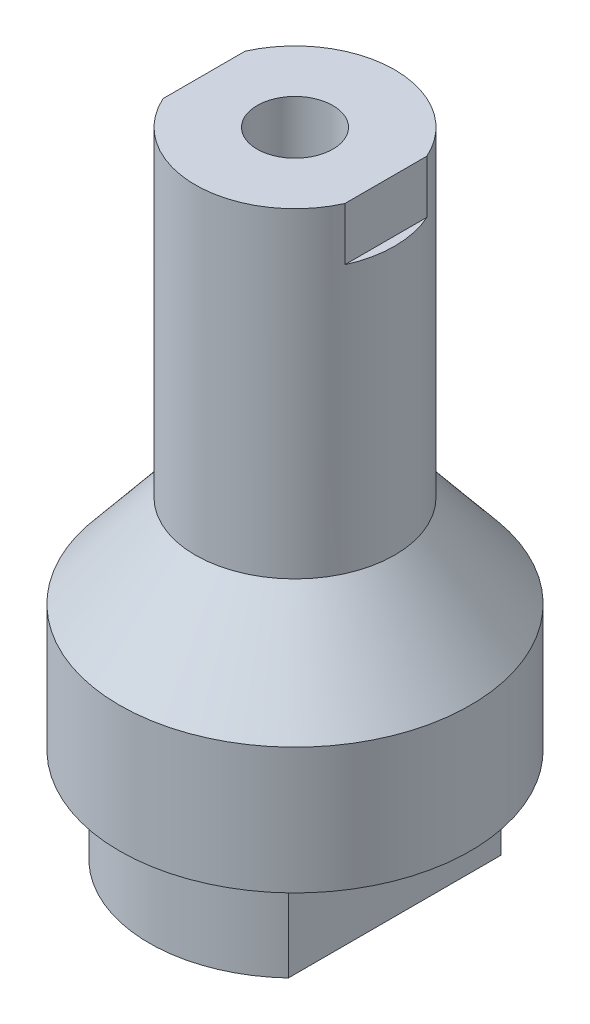
ISO-10303-21;
HEADER;
FILE_DESCRIPTION(('STEP AP214'),'2;1');
FILE_NAME('part.step','',(''),(''),'','','');
FILE_SCHEMA(('AUTOMOTIVE_DESIGN { 1 0 10303 214 1 1 1 1 }'));
ENDSEC;
DATA;
#1=APPLICATION_CONTEXT('core data for automotive mechanical design processes');
#2=APPLICATION_PROTOCOL_DEFINITION('international standard','automotive_design',2000,#1);
#3=PRODUCT_CONTEXT('',#1,'mechanical');
#4=PRODUCT('Part','Part','',(#3));
#5=PRODUCT_RELATED_PRODUCT_CATEGORY('part','',(#4));
#6=PRODUCT_DEFINITION_FORMATION('','',#4);
#7=PRODUCT_DEFINITION_CONTEXT('part definition',#1,'design');
#8=PRODUCT_DEFINITION('design','',#6,#7);
#9=PRODUCT_DEFINITION_SHAPE('','',#8);
#10=(LENGTH_UNIT() NAMED_UNIT(*) SI_UNIT(.MILLI.,.METRE.));
#11=(NAMED_UNIT(*) PLANE_ANGLE_UNIT() SI_UNIT($,.RADIAN.));
#12=(NAMED_UNIT(*) SI_UNIT($,.STERADIAN.) SOLID_ANGLE_UNIT());
#13=UNCERTAINTY_MEASURE_WITH_UNIT(LENGTH_MEASURE(1.E-05),#10,'distance_accuracy_value','');
#14=(GEOMETRIC_REPRESENTATION_CONTEXT(3) GLOBAL_UNCERTAINTY_ASSIGNED_CONTEXT((#13)) GLOBAL_UNIT_ASSIGNED_CONTEXT((#10,
#11,#12)) REPRESENTATION_CONTEXT('',''));
#15=CARTESIAN_POINT('',(0.,0.,0.));
#16=DIRECTION('',(0.,0.,1.));
#17=DIRECTION('',(1.,0.,0.));
#18=AXIS2_PLACEMENT_3D('',#15,#16,#17);
#19=CARTESIAN_POINT('',(-3.95,25.1,0.));
#20=DIRECTION('',(0.,-1.,0.));
#21=DIRECTION('',(0.,0.,-1.));
#22=AXIS2_PLACEMENT_3D('',#19,#20,#21);
#23=PLANE('',#22);
#24=CARTESIAN_POINT('',(0.,25.1,0.));
#25=DIRECTION('',(0.,1.,0.));
#26=DIRECTION('',(0.,0.,1.));
#27=AXIS2_PLACEMENT_3D('',#24,#25,#26);
#28=CIRCLE('',#27,1.5);
#29=CARTESIAN_POINT('',(0.,25.1,1.5));
#30=VERTEX_POINT('',#29);
#31=EDGE_CURVE('E195',#30,#30,#28,.T.);
#32=ORIENTED_EDGE('',*,*,#31,.F.);
#33=EDGE_LOOP('',(#32));
#34=FACE_BOUND('',#33,.T.);
#35=DIRECTION('',(0.,0.,1.));
#36=VECTOR('',#35,1.);
#37=CARTESIAN_POINT('',(3.6,25.1,-6.95));
#38=LINE('',#37,#36);
#39=CARTESIAN_POINT('',(3.6,25.1,-1.6255768207009));
#40=VERTEX_POINT('',#39);
#41=CARTESIAN_POINT('',(3.59999999999999,25.1,1.6255768207009));
#42=VERTEX_POINT('',#41);
#43=EDGE_CURVE('E72',#40,#42,#38,.T.);
#44=ORIENTED_EDGE('',*,*,#43,.F.);
#45=CARTESIAN_POINT('',(0.,25.1,0.));
#46=DIRECTION('',(0.,-1.,0.));
#47=DIRECTION('',(0.,0.,-1.));
#48=AXIS2_PLACEMENT_3D('',#45,#46,#47);
#49=CIRCLE('',#48,3.95);
#50=CARTESIAN_POINT('',(-3.6,25.1,-1.6255768207009));
#51=VERTEX_POINT('',#50);
#52=EDGE_CURVE('E161',#51,#40,#49,.T.);
#53=ORIENTED_EDGE('',*,*,#52,.F.);
#54=DIRECTION('',(0.,0.,1.));
#55=VECTOR('',#54,1.);
#56=CARTESIAN_POINT('',(-3.6,25.1,-6.95));
#57=LINE('',#56,#55);
#58=CARTESIAN_POINT('',(-3.6,25.1,1.6255768207009));
#59=VERTEX_POINT('',#58);
#60=EDGE_CURVE('E269',#51,#59,#57,.T.);
#61=ORIENTED_EDGE('',*,*,#60,.T.);
#62=EDGE_CURVE('E164',#42,#59,#49,.T.);
#63=ORIENTED_EDGE('',*,*,#62,.F.);
#64=EDGE_LOOP('',(#44,#53,#61,#63));
#65=FACE_BOUND('',#64,.T.);
#66=ADVANCED_FACE('F44',(#34,#65),#23,.F.);
#67=CARTESIAN_POINT('',(0.,0.,0.));
#68=DIRECTION('',(0.,-1.,0.));
#69=DIRECTION('',(0.,0.,-1.));
#70=AXIS2_PLACEMENT_3D('',#67,#68,#69);
#71=CYLINDRICAL_SURFACE('',#70,5.775);
#72=CARTESIAN_POINT('',(0.,0.,0.));
#73=DIRECTION('',(0.,-1.,0.));
#74=DIRECTION('',(0.,0.,-1.));
#75=AXIS2_PLACEMENT_3D('',#72,#73,#74);
#76=CIRCLE('',#75,5.775);
#77=CARTESIAN_POINT('',(3.95,0.,4.21285235915051));
#78=VERTEX_POINT('',#77);
#79=CARTESIAN_POINT('',(-3.95,0.,4.21285235915051));
#80=VERTEX_POINT('',#79);
#81=EDGE_CURVE('E149',#78,#80,#76,.T.);
#82=ORIENTED_EDGE('',*,*,#81,.F.);
#83=DIRECTION('',(0.,-1.,0.));
#84=VECTOR('',#83,1.);
#85=CARTESIAN_POINT('',(3.95,0.,4.21285235915051));
#86=LINE('',#85,#84);
#87=CARTESIAN_POINT('',(3.95,3.75,4.21285235915051));
#88=VERTEX_POINT('',#87);
#89=EDGE_CURVE('E122',#78,#88,#86,.F.);
#90=ORIENTED_EDGE('',*,*,#89,.T.);
#91=CARTESIAN_POINT('',(0.,3.75,0.));
#92=DIRECTION('',(0.,-1.,0.));
#93=DIRECTION('',(0.,0.,-1.));
#94=AXIS2_PLACEMENT_3D('',#91,#92,#93);
#95=CIRCLE('',#94,5.775);
#96=CARTESIAN_POINT('',(-3.95,3.75,4.21285235915051));
#97=VERTEX_POINT('',#96);
#98=EDGE_CURVE('E131',#88,#97,#95,.T.);
#99=ORIENTED_EDGE('',*,*,#98,.T.);
#100=DIRECTION('',(0.,-1.,0.));
#101=VECTOR('',#100,1.);
#102=CARTESIAN_POINT('',(-3.95,0.,4.21285235915051));
#103=LINE('',#102,#101);
#104=EDGE_CURVE('E114',#97,#80,#103,.T.);
#105=ORIENTED_EDGE('',*,*,#104,.T.);
#106=EDGE_LOOP('',(#82,#90,#99,#105));
#107=FACE_BOUND('',#106,.T.);
#108=ADVANCED_FACE('F137',(#107),#71,.T.);
#109=CARTESIAN_POINT('',(-5.775,0.,0.));
#110=DIRECTION('',(0.,1.,0.));
#111=DIRECTION('',(0.,0.,1.));
#112=AXIS2_PLACEMENT_3D('',#109,#110,#111);
#113=PLANE('',#112);
#114=CARTESIAN_POINT('',(0.,0.,1.5));
#115=CARTESIAN_POINT('',(0.0247347685201529,0.,1.50000191731977));
#116=CARTESIAN_POINT('',(0.0494707785274616,0.,1.49941047911439));
#117=CARTESIAN_POINT('',(0.0987112851079547,0.,1.49702973717077));
#118=CARTESIAN_POINT('',(0.123216190082783,0.,1.49524884881535));
#119=CARTESIAN_POINT('',(0.171994793238904,0.,1.49048966041373));
#120=CARTESIAN_POINT('',(0.196269036682613,0.,1.48751696987769));
#121=CARTESIAN_POINT('',(0.244586042998842,0.,1.4803776814201));
#122=CARTESIAN_POINT('',(0.268629201508652,0.,1.47621376215505));
#123=CARTESIAN_POINT('',(0.316484279184045,0.,1.46669479873131));
#124=CARTESIAN_POINT('',(0.340296144201122,0.,1.46133948234814));
#125=CARTESIAN_POINT('',(0.387689162550824,0.,1.44944085464064));
#126=CARTESIAN_POINT('',(0.411269522479252,0.,1.44289438479575));
#127=CARTESIAN_POINT('',(0.45820019306478,0.,1.4286158629683));
#128=CARTESIAN_POINT('',(0.481548707481012,0.,1.4208779118391));
#129=CARTESIAN_POINT('',(0.528017236187306,0.,1.4042208104248));
#130=CARTESIAN_POINT('',(0.551134233991374,0.,1.3952932559666));
#131=CARTESIAN_POINT('',(0.596863360533481,0.,1.3763671537974));
#132=CARTESIAN_POINT('',(0.619476529112188,0.,1.36637111919515));
#133=CARTESIAN_POINT('',(0.664034064580823,0.,1.34535395524988));
#134=CARTESIAN_POINT('',(0.685981934198691,0.,1.33434026040495));
#135=CARTESIAN_POINT('',(0.729210117766951,0.,1.31129212983656));
#136=CARTESIAN_POINT('',(0.750492963164667,0.,1.29926244372847));
#137=CARTESIAN_POINT('',(0.792392002461754,0.,1.27418461850148));
#138=CARTESIAN_POINT('',(0.813009449986805,0.,1.26113857441519));
#139=CARTESIAN_POINT('',(0.853579049090866,0.,1.23403079687982));
#140=CARTESIAN_POINT('',(0.873530892242338,0.,1.21996860186597));
#141=CARTESIAN_POINT('',(0.912770987715195,0.,1.19083115451219));
#142=CARTESIAN_POINT('',(0.932057129930069,0.,1.17575306119576));
#143=CARTESIAN_POINT('',(0.969967308363591,0.,1.14458573744704));
#144=CARTESIAN_POINT('',(0.988587248641874,0.,1.12849152738394));
#145=CARTESIAN_POINT('',(1.0251683934935,0.,1.0952956693226));
#146=CARTESIAN_POINT('',(1.04312341285187,0.,1.07818721107137));
#147=CARTESIAN_POINT('',(1.07814252919734,0.,1.04318750384702));
#148=CARTESIAN_POINT('',(1.09520921716562,0.,1.02529884784115));
#149=CARTESIAN_POINT('',(1.12833220882844,0.,0.988830206366507));
#150=CARTESIAN_POINT('',(1.14439459506981,0.,0.970255750427472));
#151=CARTESIAN_POINT('',(1.17551206025706,0.,0.932419313632601));
#152=CARTESIAN_POINT('',(1.19057129531396,0.,0.913160751866436));
#153=CARTESIAN_POINT('',(1.21968410022337,0.,0.873957802530341));
#154=CARTESIAN_POINT('',(1.23373963003822,0.,0.854014870805264));
#155=CARTESIAN_POINT('',(1.2608473527173,0.,0.81344523431549));
#156=CARTESIAN_POINT('',(1.27389908400022,0.,0.792818221152427));
#157=CARTESIAN_POINT('',(1.29900178729561,0.,0.750882196087031));
#158=CARTESIAN_POINT('',(1.31104972262622,0.,0.729571366964465));
#159=CARTESIAN_POINT('',(1.33414694196369,0.,0.68626891710449));
#160=CARTESIAN_POINT('',(1.34519053619435,0.,0.664274263238092));
#161=CARTESIAN_POINT('',(1.36628360233903,0.,0.61960629138295));
#162=CARTESIAN_POINT('',(1.37632475368796,0.,0.596929048519568));
#163=CARTESIAN_POINT('',(1.39528439042207,0.,0.551192299717979));
#164=CARTESIAN_POINT('',(1.40420626184726,0.,0.528134197843505));
#165=CARTESIAN_POINT('',(1.42085197100997,0.,0.481765946269994));
#166=CARTESIAN_POINT('',(1.42858354434745,0.,0.458458577500448));
#167=CARTESIAN_POINT('',(1.44285295603563,0.,0.411594129577346));
#168=CARTESIAN_POINT('',(1.44939594256118,0.,0.388038618775925));
#169=CARTESIAN_POINT('',(1.46129034794042,0.,0.340678828161953));
#170=CARTESIAN_POINT('',(1.4666441346909,0.,0.31687514332955));
#171=CARTESIAN_POINT('',(1.47616307710533,0.,0.269020010176734));
#172=CARTESIAN_POINT('',(1.4803276883048,0.,0.244968453572904));
#173=CARTESIAN_POINT('',(1.48747134007836,0.,0.196618229681386));
#174=CARTESIAN_POINT('',(1.49044687970416,0.,0.172319045588958));
#175=CARTESIAN_POINT('',(1.49521479776574,0.,0.123473875281554));
#176=CARTESIAN_POINT('',(1.49700075880554,0.,0.0989272642038695));
#177=CARTESIAN_POINT('',(1.49939451810823,0.,0.0495874722967311));
#178=CARTESIAN_POINT('',(1.49999312718683,0.,0.0247938494983392));
#179=CARTESIAN_POINT('',(1.50000685149273,0.,-0.0247169354649001));
#180=CARTESIAN_POINT('',(1.49942563232503,0.,-0.0494340962254184));
#181=CARTESIAN_POINT('',(1.49705990065969,0.,-0.0986428119290848));
#182=CARTESIAN_POINT('',(1.49528359914018,0.,-0.123134757914345));
#183=CARTESIAN_POINT('',(1.49053256875276,0.,-0.171892529595621));
#184=CARTESIAN_POINT('',(1.48756319636062,0.,-0.196158876444427));
#185=CARTESIAN_POINT('',(1.48042838681365,0.,-0.244465409533176));
#186=CARTESIAN_POINT('',(1.47626536499926,0.,-0.26850595223801));
#187=CARTESIAN_POINT('',(1.46674635445589,0.,-0.316361071839137));
#188=CARTESIAN_POINT('',(1.46138982126907,0.,-0.340175540418728));
#189=CARTESIAN_POINT('',(1.44948686529562,0.,-0.387579079844759));
#190=CARTESIAN_POINT('',(1.4429370102819,0.,-0.411167288401608));
#191=CARTESIAN_POINT('',(1.42864975476398,0.,-0.458118944759668));
#192=CARTESIAN_POINT('',(1.42090618623437,0.,-0.481480514027625));
#193=CARTESIAN_POINT('',(1.40423621054066,0.,-0.527980589935173));
#194=CARTESIAN_POINT('',(1.39530114454309,0.,-0.551115988352237));
#195=CARTESIAN_POINT('',(1.37636686701955,0.,-0.596863241282831));
#196=CARTESIAN_POINT('',(1.36637104260843,0.,-0.61947649726523));
#197=CARTESIAN_POINT('',(1.3453540313156,0.,-0.664034096211297));
#198=CARTESIAN_POINT('',(1.3343402807432,0.,-0.685981942656063));
#199=CARTESIAN_POINT('',(1.31129210958844,0.,-0.729210109347346));
#200=CARTESIAN_POINT('',(1.29926243830786,0.,-0.750492960910791));
#201=CARTESIAN_POINT('',(1.27418462391098,0.,-0.79239200471137));
#202=CARTESIAN_POINT('',(1.26113857586505,0.,-0.813009450589888));
#203=CARTESIAN_POINT('',(1.23403079542907,0.,-0.853579048487794));
#204=CARTESIAN_POINT('',(1.21996860147656,0.,-0.873530892080598));
#205=CARTESIAN_POINT('',(1.19083115490252,0.,-0.91277098787768));
#206=CARTESIAN_POINT('',(1.17575306130056,0.,-0.932057129973811));
#207=CARTESIAN_POINT('',(1.1445857373415,0.,-0.969967308319832));
#208=CARTESIAN_POINT('',(1.12849152735552,0.,-0.988587248630164));
#209=CARTESIAN_POINT('',(1.09529566935114,0.,-1.02516839350542));
#210=CARTESIAN_POINT('',(1.07818721107899,0.,-1.04312341285507));
#211=CARTESIAN_POINT('',(1.0431875038394,0.,-1.07814252919417));
#212=CARTESIAN_POINT('',(1.02529884783911,0.,-1.09520921716477));
#213=CARTESIAN_POINT('',(0.988830206368514,0.,-1.12833220882927));
#214=CARTESIAN_POINT('',(0.970255750427997,0.,-1.14439459507003));
#215=CARTESIAN_POINT('',(0.932419313632045,0.,-1.17551206025683));
#216=CARTESIAN_POINT('',(0.913160751866272,0.,-1.19057129531389));
#217=CARTESIAN_POINT('',(0.873957802530463,0.,-1.21968410022342));
#218=CARTESIAN_POINT('',(0.85401487080528,0.,-1.23373963003823));
#219=CARTESIAN_POINT('',(0.813445234315428,0.,-1.26084735271728));
#220=CARTESIAN_POINT('',(0.792818221152394,0.,-1.27389908400021));
#221=CARTESIAN_POINT('',(0.750882196087021,0.,-1.29900178729561));
#222=CARTESIAN_POINT('',(0.729571366964449,0.,-1.31104972262622));
#223=CARTESIAN_POINT('',(0.686268917104472,0.,-1.33414694196368));
#224=CARTESIAN_POINT('',(0.664274263238079,0.,-1.34519053619434));
#225=CARTESIAN_POINT('',(0.619606291382943,0.,-1.36628360233903));
#226=CARTESIAN_POINT('',(0.596929048519564,0.,-1.37632475368796));
#227=CARTESIAN_POINT('',(0.551192299717963,0.,-1.39528439042208));
#228=CARTESIAN_POINT('',(0.528134197843473,0.,-1.40420626184728));
#229=CARTESIAN_POINT('',(0.481765946269936,0.,-1.42085197101));
#230=CARTESIAN_POINT('',(0.45845857750038,0.,-1.4285835443475));
#231=CARTESIAN_POINT('',(0.411594129577261,0.,-1.44285295603568));
#232=CARTESIAN_POINT('',(0.388038618775832,0.,-1.44939594256124));
#233=CARTESIAN_POINT('',(0.340678828161852,0.,-1.46129034794048));
#234=CARTESIAN_POINT('',(0.316875143329447,0.,-1.46664413469097));
#235=CARTESIAN_POINT('',(0.269020010176631,0.,-1.47616307710539));
#236=CARTESIAN_POINT('',(0.244968453572804,0.,-1.48032768830486));
#237=CARTESIAN_POINT('',(0.196618229681294,0.,-1.48747134007842));
#238=CARTESIAN_POINT('',(0.172319045588873,0.,-1.49044687970421));
#239=CARTESIAN_POINT('',(0.123473875281486,0.,-1.49521479776578));
#240=CARTESIAN_POINT('',(0.0989272642038126,0.,-1.49700075880558));
#241=CARTESIAN_POINT('',(0.0495874722967004,0.,-1.49939451810825));
#242=CARTESIAN_POINT('',(0.024793849498324,0.,-1.49999312718684));
#243=CARTESIAN_POINT('',(-0.0247169354649021,0.,-1.50000685149272));
#244=CARTESIAN_POINT('',(-0.0494340962254227,0.,-1.49942563232501));
#245=CARTESIAN_POINT('',(-0.0986428119290929,0.,-1.49705990065965));
#246=CARTESIAN_POINT('',(-0.123134757914355,0.,-1.49528359914014));
#247=CARTESIAN_POINT('',(-0.171892529595633,0.,-1.49053256875271));
#248=CARTESIAN_POINT('',(-0.19615887644444,0.,-1.48756319636057));
#249=CARTESIAN_POINT('',(-0.244465409533189,0.,-1.48042838681359));
#250=CARTESIAN_POINT('',(-0.268505952238023,0.,-1.47626536499919));
#251=CARTESIAN_POINT('',(-0.316361071839151,0.,-1.46674635445583));
#252=CARTESIAN_POINT('',(-0.340175540418741,0.,-1.46138982126901));
#253=CARTESIAN_POINT('',(-0.387579079844771,0.,-1.44948686529556));
#254=CARTESIAN_POINT('',(-0.411167288401619,0.,-1.44293701028185));
#255=CARTESIAN_POINT('',(-0.458118944759677,0.,-1.42864975476394));
#256=CARTESIAN_POINT('',(-0.481480514027632,0.,-1.42090618623434));
#257=CARTESIAN_POINT('',(-0.527980589935176,0.,-1.40423621054064));
#258=CARTESIAN_POINT('',(-0.551115988352239,0.,-1.39530114454308));
#259=CARTESIAN_POINT('',(-0.596863241282786,0.,-1.37636686701958));
#260=CARTESIAN_POINT('',(-0.61947649726514,0.,-1.36637104260848));
#261=CARTESIAN_POINT('',(-0.664034096211131,0.,-1.3453540313157));
#262=CARTESIAN_POINT('',(-0.685981942655866,0.,-1.33434028074332));
#263=CARTESIAN_POINT('',(-0.729210109347099,0.,-1.31129210958859));
#264=CARTESIAN_POINT('',(-0.750492960910523,0.,-1.29926243830802));
#265=CARTESIAN_POINT('',(-0.792392004711078,0.,-1.27418462391115));
#266=CARTESIAN_POINT('',(-0.813009450589589,0.,-1.26113857586523));
#267=CARTESIAN_POINT('',(-0.853579048487496,0.,-1.23403079542925));
#268=CARTESIAN_POINT('',(-0.873530892080306,0.,-1.21996860147674));
#269=CARTESIAN_POINT('',(-0.912770987877413,0.,-1.19083115490268));
#270=CARTESIAN_POINT('',(-0.932057129973562,0.,-1.17575306130071));
#271=CARTESIAN_POINT('',(-0.969967308319634,0.,-1.14458573734162));
#272=CARTESIAN_POINT('',(-0.988587248629997,0.,-1.12849152735561));
#273=CARTESIAN_POINT('',(-1.02516839350534,0.,-1.09529566935119));
#274=CARTESIAN_POINT('',(-1.04312341285502,0.,-1.07818721107902));
#275=CARTESIAN_POINT('',(-1.07814252919418,0.,-1.04318750383941));
#276=CARTESIAN_POINT('',(-1.09520921716479,0.,-1.02529884783912));
#277=CARTESIAN_POINT('',(-1.12833220882931,0.,-0.988830206368542));
#278=CARTESIAN_POINT('',(-1.14439459507007,0.,-0.97025575042803));
#279=CARTESIAN_POINT('',(-1.17551206025689,0.,-0.932419313632085));
#280=CARTESIAN_POINT('',(-1.19057129531396,0.,-0.913160751866316));
#281=CARTESIAN_POINT('',(-1.2196841002235,0.,-0.873957802530511));
#282=CARTESIAN_POINT('',(-1.2337396300383,0.,-0.854014870805329));
#283=CARTESIAN_POINT('',(-1.26084735271735,0.,-0.813445234315477));
#284=CARTESIAN_POINT('',(-1.27389908400028,0.,-0.792818221152442));
#285=CARTESIAN_POINT('',(-1.29900178729568,0.,-0.750882196087065));
#286=CARTESIAN_POINT('',(-1.31104972262628,0.,-0.72957136696449));
#287=CARTESIAN_POINT('',(-1.33414694196373,0.,-0.686268917104504));
#288=CARTESIAN_POINT('',(-1.34519053619439,0.,-0.664274263238106));
#289=CARTESIAN_POINT('',(-1.36628360233905,0.,-0.619606291382958));
#290=CARTESIAN_POINT('',(-1.37632475368797,0.,-0.596929048519571));
#291=CARTESIAN_POINT('',(-1.39528439042207,0.,-0.55119229971795));
#292=CARTESIAN_POINT('',(-1.40420626184726,0.,-0.528134197843449));
#293=CARTESIAN_POINT('',(-1.42085197100997,0.,-0.481765946269892));
#294=CARTESIAN_POINT('',(-1.42858354434745,0.,-0.458458577500327));
#295=CARTESIAN_POINT('',(-1.44285295603563,0.,-0.411594129577195));
#296=CARTESIAN_POINT('',(-1.44939594256118,0.,-0.388038618775762));
#297=CARTESIAN_POINT('',(-1.46129034794042,0.,-0.340678828161775));
#298=CARTESIAN_POINT('',(-1.4666441346909,0.,-0.316875143329369));
#299=CARTESIAN_POINT('',(-1.47616307710533,0.,-0.269020010176552));
#300=CARTESIAN_POINT('',(-1.4803276883048,0.,-0.244968453572727));
#301=CARTESIAN_POINT('',(-1.48747134007836,0.,-0.196618229681224));
#302=CARTESIAN_POINT('',(-1.49044687970416,0.,-0.172319045588808));
#303=CARTESIAN_POINT('',(-1.49521479776574,0.,-0.123473875281435));
#304=CARTESIAN_POINT('',(-1.49700075880555,0.,-0.0989272642037694));
#305=CARTESIAN_POINT('',(-1.49939451810823,0.,-0.0495874722966772));
#306=CARTESIAN_POINT('',(-1.49999312718683,0.,-0.0247938494983124));
#307=CARTESIAN_POINT('',(-1.50000685149273,0.,0.0247169354648811));
#308=CARTESIAN_POINT('',(-1.49942563232503,0.,0.0494340962253807));
#309=CARTESIAN_POINT('',(-1.49705990065969,0.,0.098642811929015));
#310=CARTESIAN_POINT('',(-1.49528359914018,0.,0.123134757914262));
#311=CARTESIAN_POINT('',(-1.49053256875276,0.,0.171892529595516));
#312=CARTESIAN_POINT('',(-1.48756319636062,0.,0.196158876444314));
#313=CARTESIAN_POINT('',(-1.48042838681365,0.,0.244465409533052));
#314=CARTESIAN_POINT('',(-1.47626536499926,0.,0.268505952237883));
#315=CARTESIAN_POINT('',(-1.46674635445589,0.,0.316361071839011));
#316=CARTESIAN_POINT('',(-1.46138982126907,0.,0.340175540418604));
#317=CARTESIAN_POINT('',(-1.44948686529562,0.,0.387579079844646));
#318=CARTESIAN_POINT('',(-1.4429370102819,0.,0.411167288401503));
#319=CARTESIAN_POINT('',(-1.42864975476398,0.,0.458118944759585));
#320=CARTESIAN_POINT('',(-1.42090618623437,0.,0.481480514027555));
#321=CARTESIAN_POINT('',(-1.40423621054066,0.,0.527980589935135));
#322=CARTESIAN_POINT('',(-1.39530114454309,0.,0.551115988352218));
#323=CARTESIAN_POINT('',(-1.37636686701958,0.,0.596863241282787));
#324=CARTESIAN_POINT('',(-1.36637104260848,0.,0.619476497265143));
#325=CARTESIAN_POINT('',(-1.3453540313157,0.,0.664034096211133));
#326=CARTESIAN_POINT('',(-1.33434028074332,0.,0.685981942655866));
#327=CARTESIAN_POINT('',(-1.31129210958859,0.,0.729210109347105));
#328=CARTESIAN_POINT('',(-1.29926243830802,0.,0.750492960910538));
#329=CARTESIAN_POINT('',(-1.27418462391114,0.,0.792392004711071));
#330=CARTESIAN_POINT('',(-1.26113857586521,0.,0.813009450589554));
#331=CARTESIAN_POINT('',(-1.23403079542926,0.,0.853579048487538));
#332=CARTESIAN_POINT('',(-1.21996860147679,0.,0.873530892080454));
#333=CARTESIAN_POINT('',(-1.19083115490261,0.,0.912770987877271));
#334=CARTESIAN_POINT('',(-1.17575306130048,0.,0.932057129973023));
#335=CARTESIAN_POINT('',(-1.14458573734184,0.,0.969967308320182));
#336=CARTESIAN_POINT('',(-1.12849152735646,0.,0.98858724863204));
#337=CARTESIAN_POINT('',(-1.09529566935033,0.,1.02516839350328));
#338=CARTESIAN_POINT('',(-1.07818721107581,0.,1.04312341284731));
#339=CARTESIAN_POINT('',(-1.04318750384264,0.,1.07814252920183));
#340=CARTESIAN_POINT('',(-1.02529884785113,0.,1.09520921719338));
#341=CARTESIAN_POINT('',(-0.988830206356794,0.,1.12833220880074));
#342=CARTESIAN_POINT('',(-0.970255750384033,0.,1.14439459496408));
#343=CARTESIAN_POINT('',(-0.932419313676199,0.,1.1755120603621));
#344=CARTESIAN_POINT('',(-0.913160752030113,0.,1.19057129570617));
#345=CARTESIAN_POINT('',(-0.873957802367435,0.,1.21968409983168));
#346=CARTESIAN_POINT('',(-0.854014870196835,0.,1.23373962857818));
#347=CARTESIAN_POINT('',(-0.813445234924669,0.,1.26084735417772));
#348=CARTESIAN_POINT('',(-0.792818223425702,0.,1.27389908945174));
#349=CARTESIAN_POINT('',(-0.750882193807554,0.,1.29900178182788));
#350=CARTESIAN_POINT('',(-0.729571358445092,0.,1.31104970219284));
#351=CARTESIAN_POINT('',(-0.686268925669809,0.,1.3341469625062));
#352=CARTESIAN_POINT('',(-0.664274295286405,0.,1.34519061305832));
#353=CARTESIAN_POINT('',(-0.619606259087762,0.,1.36628352488235));
#354=CARTESIAN_POINT('',(-0.59692892753835,0.,1.37632446352768));
#355=CARTESIAN_POINT('',(-0.551174025918391,0.,1.39529230514219));
#356=CARTESIAN_POINT('',(-0.528097495867629,0.,1.40422171623575));
#357=CARTESIAN_POINT('',(-0.481697648144714,0.,1.42088034614802));
#358=CARTESIAN_POINT('',(-0.458377204301374,0.,1.42861755810062));
#359=CARTESIAN_POINT('',(-0.411491739369876,0.,1.4428957315904));
#360=CARTESIAN_POINT('',(-0.387928369299311,0.,1.44944211148131));
#361=CARTESIAN_POINT('',(-0.340558037167883,0.,1.46134087072968));
#362=CARTESIAN_POINT('',(-0.316751739183612,0.,1.4666958924649));
#363=CARTESIAN_POINT('',(-0.2688965788893,0.,1.47621484357386));
#364=CARTESIAN_POINT('',(-0.244847662433325,0.,1.48037850069419));
#365=CARTESIAN_POINT('',(-0.196507871831742,0.,1.48751780205908));
#366=CARTESIAN_POINT('',(-0.172216519719741,0.,1.49049020834572));
#367=CARTESIAN_POINT('',(-0.123392423045591,0.,1.49524939885631));
#368=CARTESIAN_POINT('',(-0.098859079476897,0.,1.49703001297542));
#369=CARTESIAN_POINT('',(-0.0495503373854434,0.,1.49941074318796));
#370=CARTESIAN_POINT('',(-0.0247745043790516,0.,1.50000189650473));
#371=CARTESIAN_POINT('',(0.,0.,1.5));
#372=B_SPLINE_CURVE_WITH_KNOTS('',3,(#114,#115,#116,#117,#118,#119,#120,#121,#122,#123,#124,
#125,#126,#127,#128,#129,#130,#131,#132,#133,#134,#135,#136,#137,#138,#139,#140,#141,#142,#143,
#144,#145,#146,#147,#148,#149,#150,#151,#152,#153,#154,#155,#156,#157,#158,#159,#160,#161,#162,
#163,#164,#165,#166,#167,#168,#169,#170,#171,#172,#173,#174,#175,#176,#177,#178,#179,#180,#181,
#182,#183,#184,#185,#186,#187,#188,#189,#190,#191,#192,#193,#194,#195,#196,#197,#198,#199,#200,
#201,#202,#203,#204,#205,#206,#207,#208,#209,#210,#211,#212,#213,#214,#215,#216,#217,#218,#219,
#220,#221,#222,#223,#224,#225,#226,#227,#228,#229,#230,#231,#232,#233,#234,#235,#236,#237,#238,
#239,#240,#241,#242,#243,#244,#245,#246,#247,#248,#249,#250,#251,#252,#253,#254,#255,#256,#257,
#258,#259,#260,#261,#262,#263,#264,#265,#266,#267,#268,#269,#270,#271,#272,#273,#274,#275,#276,
#277,#278,#279,#280,#281,#282,#283,#284,#285,#286,#287,#288,#289,#290,#291,#292,#293,#294,#295,
#296,#297,#298,#299,#300,#301,#302,#303,#304,#305,#306,#307,#308,#309,#310,#311,#312,#313,#314,
#315,#316,#317,#318,#319,#320,#321,#322,#323,#324,#325,#326,#327,#328,#329,#330,#331,#332,#333,
#334,#335,#336,#337,#338,#339,#340,#341,#342,#343,#344,#345,#346,#347,#348,#349,#350,#351,#352,
#353,#354,#355,#356,#357,#358,#359,#360,#361,#362,#363,#364,#365,#366,#367,#368,#369,#370,#371),
.UNSPECIFIED.,.F.,.F.,(4,2,2,2,2,2,2,2,2,2,2,2,2,2,2,2,2,2,2,2,2,2,2,2,2,2,2,2,2,2,2,2,2,2,2,2,
2,2,2,2,2,2,2,2,2,2,2,2,2,2,2,2,2,2,2,2,2,2,2,2,2,2,2,2,2,2,2,2,2,2,2,2,2,2,2,2,2,2,2,2,2,2,2,2,
2,2,2,2,2,2,2,2,2,2,2,2,2,2,2,2,2,2,2,2,2,2,2,2,2,2,2,2,2,2,2,2,2,2,2,2,2,2,2,2,2,2,2,2,4),(0.,
0.0741989708048877,0.147878466158508,0.221215167441706,0.294388239176562,0.367578047562738,
0.440964835396602,0.514727401499044,0.589041832398692,0.663185166529015,0.736824221437623,
0.810136292194274,0.883301050981176,0.956499254763681,1.02991141346064,1.10371646715639,
1.17809052013483,1.25223385426517,1.32587290917379,1.39918497993044,1.47234973871734,
1.54554794249985,1.61896010119681,1.69276515489255,1.76713920787098,1.84128254200125,
1.91492159690982,1.98823366766645,2.06139842645334,2.13459663023586,2.20800878893284,
2.28181384262863,2.35618789560711,2.43033122973744,2.50397028464604,2.57728235540269,
2.65044711418959,2.7236453179721,2.79705747666907,2.87086253036482,2.94523658334327,
3.01937991747367,3.09301897238234,3.16633104313903,3.23949580192594,3.31269400570844,
3.38610616440536,3.45991121810105,3.53428527107941,3.60842860520975,3.68206766011837,
3.75537973087503,3.82854448966193,3.90174269344444,3.97515485214139,4.04895990583713,
4.12333395881555,4.19747729294587,4.27111634785448,4.34442841861113,4.41759317739804,
4.49079138118054,4.5642035398775,4.63800859357325,4.7123826465517,4.78652598068202,
4.86016503559064,4.93347710634729,5.00664186513419,5.0798400689167,5.15325222761366,
5.2270572813094,5.30143133428784,5.37557466841808,5.44921372332664,5.52252579408326,
5.59569055287015,5.66888875665267,5.74230091534966,5.81610596904546,5.89048002202397,
5.96462335615432,6.03826241106294,6.1115744818196,6.18473924060651,6.25793744438901,
6.33134960308596,6.40515465678171,6.47952870976014,6.55367204389048,6.62731109879911,
6.70062316955577,6.77378792834267,6.84698613212518,6.92039829082212,6.99420334451785,
7.06857739749626,7.14272073162653,7.21635978653509,7.28967185729172,7.36283661607861,
7.43603481986113,7.50944697855811,7.58325203225391,7.65762608523241,7.73176941936266,
7.80540847427122,7.87872054502784,7.95188530381473,8.02508350759725,8.09849566629424,
8.17230071999004,8.24667477296855,8.32081810709876,8.39445716200729,8.46776923276389,
8.54093399155078,8.6141321953333,8.68754435403031,8.76134940772614,8.8357234607047,
8.90992652587292,8.98360814499244,9.05694563133217,9.13011879991214,9.20330867686435,
9.27669616467642,9.35046071196914,9.42477903607617),.UNSPECIFIED.);
#373=CARTESIAN_POINT('',(0.,0.,1.5));
#374=VERTEX_POINT('',#373);
#375=EDGE_CURVE('E190',#374,#374,#372,.T.);
#376=ORIENTED_EDGE('',*,*,#375,.T.);
#377=EDGE_LOOP('',(#376));
#378=FACE_BOUND('',#377,.T.);
#379=CARTESIAN_POINT('',(-3.95,0.,-4.21285235915051));
#380=VERTEX_POINT('',#379);
#381=CARTESIAN_POINT('',(3.95,0.,-4.21285235915051));
#382=VERTEX_POINT('',#381);
#383=EDGE_CURVE('E151',#380,#382,#76,.T.);
#384=ORIENTED_EDGE('',*,*,#383,.T.);
#385=DIRECTION('',(0.,0.,1.));
#386=VECTOR('',#385,1.);
#387=CARTESIAN_POINT('',(3.95,0.,-6.95));
#388=LINE('',#387,#386);
#389=EDGE_CURVE('E172',#382,#78,#388,.T.);
#390=ORIENTED_EDGE('',*,*,#389,.T.);
#391=ORIENTED_EDGE('',*,*,#81,.T.);
#392=DIRECTION('',(0.,0.,1.));
#393=VECTOR('',#392,1.);
#394=CARTESIAN_POINT('',(-3.95,0.,-6.95));
#395=LINE('',#394,#393);
#396=EDGE_CURVE('E116',#380,#80,#395,.T.);
#397=ORIENTED_EDGE('',*,*,#396,.F.);
#398=EDGE_LOOP('',(#384,#390,#391,#397));
#399=FACE_BOUND('',#398,.T.);
#400=ADVANCED_FACE('F189',(#378,#399),#113,.F.);
#401=CARTESIAN_POINT('',(0.,0.,0.));
#402=DIRECTION('',(0.,-1.,0.));
#403=DIRECTION('',(0.,0.,-1.));
#404=AXIS2_PLACEMENT_3D('',#401,#402,#403);
#405=CYLINDRICAL_SURFACE('',#404,3.95);
#406=ORIENTED_EDGE('',*,*,#52,.T.);
#407=DIRECTION('',(0.,-1.,0.));
#408=VECTOR('',#407,1.);
#409=CARTESIAN_POINT('',(3.59999999999999,0.,-1.6255768207009));
#410=LINE('',#409,#408);
#411=CARTESIAN_POINT('',(3.6,23.,-1.6255768207009));
#412=VERTEX_POINT('',#411);
#413=EDGE_CURVE('E11',#40,#412,#410,.T.);
#414=ORIENTED_EDGE('',*,*,#413,.T.);
#415=CARTESIAN_POINT('',(0.,23.,0.));
#416=DIRECTION('',(0.,-1.,0.));
#417=DIRECTION('',(0.,0.,-1.));
#418=AXIS2_PLACEMENT_3D('',#415,#416,#417);
#419=CIRCLE('',#418,3.95);
#420=CARTESIAN_POINT('',(3.6,23.,1.6255768207009));
#421=VERTEX_POINT('',#420);
#422=EDGE_CURVE('E57',#412,#421,#419,.T.);
#423=ORIENTED_EDGE('',*,*,#422,.T.);
#424=DIRECTION('',(0.,-1.,0.));
#425=VECTOR('',#424,1.);
#426=CARTESIAN_POINT('',(3.59999999999999,0.,1.6255768207009));
#427=LINE('',#426,#425);
#428=EDGE_CURVE('E178',#421,#42,#427,.F.);
#429=ORIENTED_EDGE('',*,*,#428,.T.);
#430=ORIENTED_EDGE('',*,*,#62,.T.);
#431=DIRECTION('',(0.,-1.,0.));
#432=VECTOR('',#431,1.);
#433=CARTESIAN_POINT('',(-3.59999999999999,0.,1.6255768207009));
#434=LINE('',#433,#432);
#435=CARTESIAN_POINT('',(-3.6,23.,1.62557682070089));
#436=VERTEX_POINT('',#435);
#437=EDGE_CURVE('E173',#59,#436,#434,.T.);
#438=ORIENTED_EDGE('',*,*,#437,.T.);
#439=CARTESIAN_POINT('',(0.,23.,0.));
#440=DIRECTION('',(0.,-1.,0.));
#441=DIRECTION('',(0.,0.,-1.));
#442=AXIS2_PLACEMENT_3D('',#439,#440,#441);
#443=CIRCLE('',#442,3.95);
#444=CARTESIAN_POINT('',(-3.6,23.,-1.62557682070089));
#445=VERTEX_POINT('',#444);
#446=EDGE_CURVE('E167',#436,#445,#443,.T.);
#447=ORIENTED_EDGE('',*,*,#446,.T.);
#448=DIRECTION('',(0.,-1.,0.));
#449=VECTOR('',#448,1.);
#450=CARTESIAN_POINT('',(-3.59999999999999,0.,-1.6255768207009));
#451=LINE('',#450,#449);
#452=EDGE_CURVE('E168',#445,#51,#451,.F.);
#453=ORIENTED_EDGE('',*,*,#452,.T.);
#454=EDGE_LOOP('',(#406,#414,#423,#429,#430,#438,#447,#453));
#455=FACE_BOUND('',#454,.T.);
#456=CARTESIAN_POINT('',(0.,12.4,0.));
#457=DIRECTION('',(0.,-1.,0.));
#458=DIRECTION('',(0.,0.,-1.));
#459=AXIS2_PLACEMENT_3D('',#456,#457,#458);
#460=CIRCLE('',#459,3.95);
#461=CARTESIAN_POINT('',(0.,12.4,-3.95));
#462=VERTEX_POINT('',#461);
#463=EDGE_CURVE('E160',#462,#462,#460,.T.);
#464=ORIENTED_EDGE('',*,*,#463,.F.);
#465=EDGE_LOOP('',(#464));
#466=FACE_BOUND('',#465,.T.);
#467=ADVANCED_FACE('F242',(#455,#466),#405,.T.);
#468=CARTESIAN_POINT('',(0.,12.4,0.));
#469=DIRECTION('',(0.,-1.,0.));
#470=DIRECTION('',(0.,0.,-1.));
#471=AXIS2_PLACEMENT_3D('',#468,#469,#470);
#472=CONICAL_SURFACE('',#471,3.95,0.687963312105192);
#473=CARTESIAN_POINT('',(0.,8.75,0.));
#474=DIRECTION('',(0.,-1.,0.));
#475=DIRECTION('',(0.,0.,-1.));
#476=AXIS2_PLACEMENT_3D('',#473,#474,#475);
#477=CIRCLE('',#476,6.95);
#478=CARTESIAN_POINT('',(0.,8.75,-6.95));
#479=VERTEX_POINT('',#478);
#480=EDGE_CURVE('E150',#479,#479,#477,.T.);
#481=ORIENTED_EDGE('',*,*,#480,.F.);
#482=EDGE_LOOP('',(#481));
#483=FACE_BOUND('',#482,.T.);
#484=ORIENTED_EDGE('',*,*,#463,.T.);
#485=EDGE_LOOP('',(#484));
#486=FACE_BOUND('',#485,.T.);
#487=ADVANCED_FACE('F247',(#483,#486),#472,.T.);
#488=CARTESIAN_POINT('',(0.,0.,0.));
#489=DIRECTION('',(0.,-1.,0.));
#490=DIRECTION('',(0.,0.,-1.));
#491=AXIS2_PLACEMENT_3D('',#488,#489,#490);
#492=CYLINDRICAL_SURFACE('',#491,6.95);
#493=CARTESIAN_POINT('',(0.,3.75,0.));
#494=DIRECTION('',(0.,-1.,0.));
#495=DIRECTION('',(0.,0.,-1.));
#496=AXIS2_PLACEMENT_3D('',#493,#494,#495);
#497=CIRCLE('',#496,6.95);
#498=CARTESIAN_POINT('',(0.,3.75,-6.95));
#499=VERTEX_POINT('',#498);
#500=EDGE_CURVE('E142',#499,#499,#497,.T.);
#501=ORIENTED_EDGE('',*,*,#500,.F.);
#502=EDGE_LOOP('',(#501));
#503=FACE_BOUND('',#502,.T.);
#504=ORIENTED_EDGE('',*,*,#480,.T.);
#505=EDGE_LOOP('',(#504));
#506=FACE_BOUND('',#505,.T.);
#507=ADVANCED_FACE('F246',(#503,#506),#492,.T.);
#508=CARTESIAN_POINT('',(-5.775,3.75,0.));
#509=DIRECTION('',(0.,1.,0.));
#510=DIRECTION('',(0.,0.,1.));
#511=AXIS2_PLACEMENT_3D('',#508,#509,#510);
#512=PLANE('',#511);
#513=DIRECTION('',(0.,0.,1.));
#514=VECTOR('',#513,1.);
#515=CARTESIAN_POINT('',(3.95,3.75,-6.95));
#516=LINE('',#515,#514);
#517=CARTESIAN_POINT('',(3.95,3.75,-4.21285235915051));
#518=VERTEX_POINT('',#517);
#519=EDGE_CURVE('E198',#518,#88,#516,.T.);
#520=ORIENTED_EDGE('',*,*,#519,.F.);
#521=CARTESIAN_POINT('',(-3.95,3.75,-4.21285235915051));
#522=VERTEX_POINT('',#521);
#523=EDGE_CURVE('E139',#522,#518,#95,.T.);
#524=ORIENTED_EDGE('',*,*,#523,.F.);
#525=DIRECTION('',(0.,0.,1.));
#526=VECTOR('',#525,1.);
#527=CARTESIAN_POINT('',(-3.95,3.75,-6.95));
#528=LINE('',#527,#526);
#529=EDGE_CURVE('E117',#522,#97,#528,.T.);
#530=ORIENTED_EDGE('',*,*,#529,.T.);
#531=ORIENTED_EDGE('',*,*,#98,.F.);
#532=EDGE_LOOP('',(#520,#524,#530,#531));
#533=FACE_BOUND('',#532,.T.);
#534=ORIENTED_EDGE('',*,*,#500,.T.);
#535=EDGE_LOOP('',(#534));
#536=FACE_BOUND('',#535,.T.);
#537=ADVANCED_FACE('F135',(#533,#536),#512,.F.);
#538=ORIENTED_EDGE('',*,*,#523,.T.);
#539=DIRECTION('',(0.,-1.,0.));
#540=VECTOR('',#539,1.);
#541=CARTESIAN_POINT('',(3.95,0.,-4.21285235915051));
#542=LINE('',#541,#540);
#543=EDGE_CURVE('E289',#518,#382,#542,.T.);
#544=ORIENTED_EDGE('',*,*,#543,.T.);
#545=ORIENTED_EDGE('',*,*,#383,.F.);
#546=DIRECTION('',(0.,-1.,0.));
#547=VECTOR('',#546,1.);
#548=CARTESIAN_POINT('',(-3.95,0.,-4.21285235915051));
#549=LINE('',#548,#547);
#550=EDGE_CURVE('E127',#380,#522,#549,.F.);
#551=ORIENTED_EDGE('',*,*,#550,.T.);
#552=EDGE_LOOP('',(#538,#544,#545,#551));
#553=FACE_BOUND('',#552,.T.);
#554=ADVANCED_FACE('F240',(#553),#71,.T.);
#555=CARTESIAN_POINT('',(-3.95,0.,-6.95));
#556=DIRECTION('',(1.,0.,0.));
#557=DIRECTION('',(0.,0.,-1.));
#558=AXIS2_PLACEMENT_3D('',#555,#556,#557);
#559=PLANE('',#558);
#560=ORIENTED_EDGE('',*,*,#529,.F.);
#561=ORIENTED_EDGE('',*,*,#550,.F.);
#562=ORIENTED_EDGE('',*,*,#396,.T.);
#563=ORIENTED_EDGE('',*,*,#104,.F.);
#564=EDGE_LOOP('',(#560,#561,#562,#563));
#565=FACE_BOUND('',#564,.T.);
#566=ADVANCED_FACE('F113',(#565),#559,.F.);
#567=CARTESIAN_POINT('',(3.95,0.,-6.95));
#568=DIRECTION('',(-1.,0.,0.));
#569=DIRECTION('',(0.,0.,1.));
#570=AXIS2_PLACEMENT_3D('',#567,#568,#569);
#571=PLANE('',#570);
#572=ORIENTED_EDGE('',*,*,#519,.T.);
#573=ORIENTED_EDGE('',*,*,#89,.F.);
#574=ORIENTED_EDGE('',*,*,#389,.F.);
#575=ORIENTED_EDGE('',*,*,#543,.F.);
#576=EDGE_LOOP('',(#572,#573,#574,#575));
#577=FACE_BOUND('',#576,.T.);
#578=ADVANCED_FACE('F227',(#577),#571,.F.);
#579=CARTESIAN_POINT('',(-3.6,25.1,-6.95));
#580=DIRECTION('',(1.,0.,0.));
#581=DIRECTION('',(0.,1.,0.));
#582=AXIS2_PLACEMENT_3D('',#579,#580,#581);
#583=PLANE('',#582);
#584=ORIENTED_EDGE('',*,*,#60,.F.);
#585=ORIENTED_EDGE('',*,*,#452,.F.);
#586=DIRECTION('',(0.,0.,1.));
#587=VECTOR('',#586,1.);
#588=CARTESIAN_POINT('',(-3.6,23.,-6.95));
#589=LINE('',#588,#587);
#590=EDGE_CURVE('E64',#445,#436,#589,.T.);
#591=ORIENTED_EDGE('',*,*,#590,.T.);
#592=ORIENTED_EDGE('',*,*,#437,.F.);
#593=EDGE_LOOP('',(#584,#585,#591,#592));
#594=FACE_BOUND('',#593,.T.);
#595=ADVANCED_FACE('F224',(#594),#583,.F.);
#596=CARTESIAN_POINT('',(-3.95,23.,-6.95));
#597=DIRECTION('',(0.,-1.,0.));
#598=DIRECTION('',(0.,0.,-1.));
#599=AXIS2_PLACEMENT_3D('',#596,#597,#598);
#600=PLANE('',#599);
#601=ORIENTED_EDGE('',*,*,#590,.F.);
#602=ORIENTED_EDGE('',*,*,#446,.F.);
#603=EDGE_LOOP('',(#601,#602));
#604=FACE_BOUND('',#603,.T.);
#605=ADVANCED_FACE('F218',(#604),#600,.F.);
#606=CARTESIAN_POINT('',(3.95,23.,-6.95));
#607=DIRECTION('',(0.,-1.,0.));
#608=DIRECTION('',(0.,0.,-1.));
#609=AXIS2_PLACEMENT_3D('',#606,#607,#608);
#610=PLANE('',#609);
#611=DIRECTION('',(0.,0.,1.));
#612=VECTOR('',#611,1.);
#613=CARTESIAN_POINT('',(3.6,23.,-6.95));
#614=LINE('',#613,#612);
#615=EDGE_CURVE('E203',#412,#421,#614,.T.);
#616=ORIENTED_EDGE('',*,*,#615,.T.);
#617=ORIENTED_EDGE('',*,*,#422,.F.);
#618=EDGE_LOOP('',(#616,#617));
#619=FACE_BOUND('',#618,.T.);
#620=ADVANCED_FACE('F225',(#619),#610,.F.);
#621=CARTESIAN_POINT('',(3.6,25.1,-6.95));
#622=DIRECTION('',(-1.,0.,0.));
#623=DIRECTION('',(0.,-1.,0.));
#624=AXIS2_PLACEMENT_3D('',#621,#622,#623);
#625=PLANE('',#624);
#626=ORIENTED_EDGE('',*,*,#43,.T.);
#627=ORIENTED_EDGE('',*,*,#428,.F.);
#628=ORIENTED_EDGE('',*,*,#615,.F.);
#629=ORIENTED_EDGE('',*,*,#413,.F.);
#630=EDGE_LOOP('',(#626,#627,#628,#629));
#631=FACE_BOUND('',#630,.T.);
#632=ADVANCED_FACE('F217',(#631),#625,.F.);
#633=CARTESIAN_POINT('',(0.,25.1,0.));
#634=DIRECTION('',(0.,-1.,0.));
#635=DIRECTION('',(0.,0.,-1.));
#636=AXIS2_PLACEMENT_3D('',#633,#634,#635);
#637=CYLINDRICAL_SURFACE('',#636,1.5);
#638=ORIENTED_EDGE('',*,*,#31,.T.);
#639=EDGE_LOOP('',(#638));
#640=FACE_BOUND('',#639,.T.);
#641=ORIENTED_EDGE('',*,*,#375,.F.);
#642=EDGE_LOOP('',(#641));
#643=FACE_BOUND('',#642,.T.);
#644=ADVANCED_FACE('F207',(#640,#643),#637,.F.);
#645=CLOSED_SHELL('',(#66,#108,#400,#467,#487,#507,#537,#554,#566,#578,#595,#605,#620,#632,#644));
#646=MANIFOLD_SOLID_BREP('B2',#645);
#647=ADVANCED_BREP_SHAPE_REPRESENTATION('',(#18,#646),#14);
#648=SHAPE_DEFINITION_REPRESENTATION(#9,#647);
ENDSEC;
END-ISO-10303-21;
